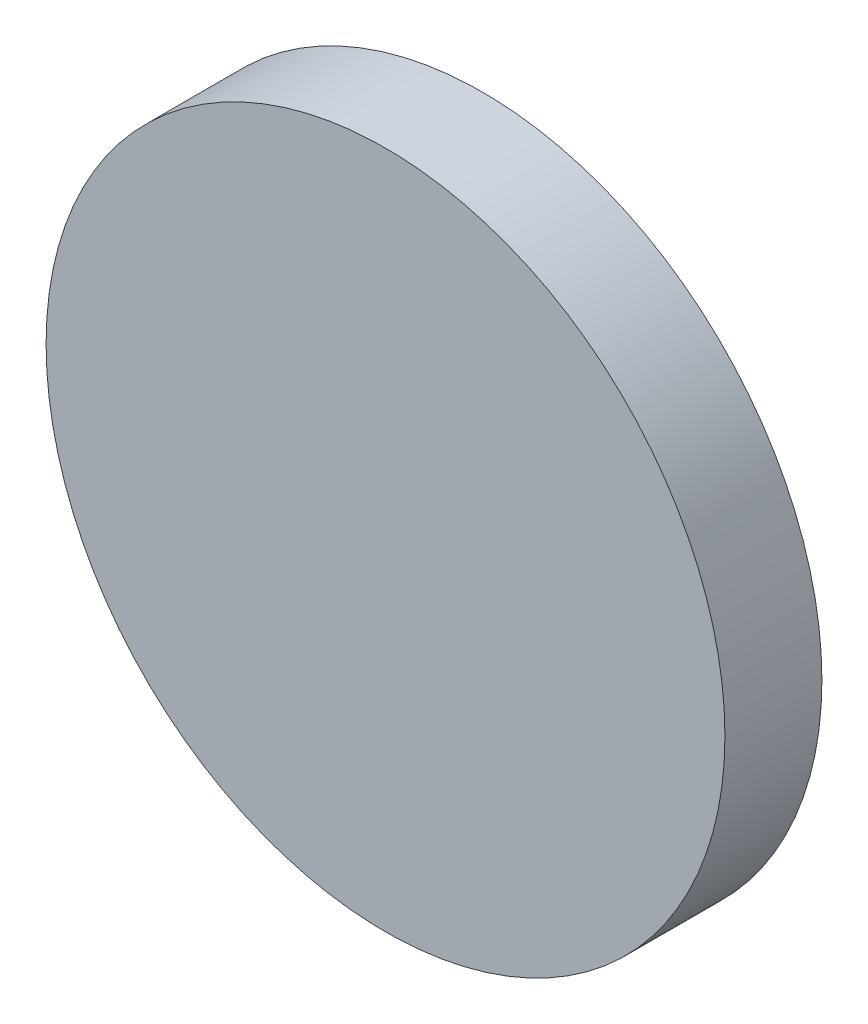
ISO-10303-21;
HEADER;
FILE_DESCRIPTION(('STEP AP214'),'2;1');
FILE_NAME('part.step','',(''),(''),'','','');
FILE_SCHEMA(('AUTOMOTIVE_DESIGN { 1 0 10303 214 1 1 1 1 }'));
ENDSEC;
DATA;
#1=APPLICATION_CONTEXT('core data for automotive mechanical design processes');
#2=APPLICATION_PROTOCOL_DEFINITION('international standard','automotive_design',2000,#1);
#3=PRODUCT_CONTEXT('',#1,'mechanical');
#4=PRODUCT('Part','Part','',(#3));
#5=PRODUCT_RELATED_PRODUCT_CATEGORY('part','',(#4));
#6=PRODUCT_DEFINITION_FORMATION('','',#4);
#7=PRODUCT_DEFINITION_CONTEXT('part definition',#1,'design');
#8=PRODUCT_DEFINITION('design','',#6,#7);
#9=PRODUCT_DEFINITION_SHAPE('','',#8);
#10=(LENGTH_UNIT() NAMED_UNIT(*) SI_UNIT(.MILLI.,.METRE.));
#11=(NAMED_UNIT(*) PLANE_ANGLE_UNIT() SI_UNIT($,.RADIAN.));
#12=(NAMED_UNIT(*) SI_UNIT($,.STERADIAN.) SOLID_ANGLE_UNIT());
#13=UNCERTAINTY_MEASURE_WITH_UNIT(LENGTH_MEASURE(1.E-05),#10,'distance_accuracy_value','');
#14=(GEOMETRIC_REPRESENTATION_CONTEXT(3) GLOBAL_UNCERTAINTY_ASSIGNED_CONTEXT((#13)) GLOBAL_UNIT_ASSIGNED_CONTEXT((#10,
#11,#12)) REPRESENTATION_CONTEXT('',''));
#15=CARTESIAN_POINT('',(0.,0.,0.));
#16=DIRECTION('',(0.,0.,1.));
#17=DIRECTION('',(1.,0.,0.));
#18=AXIS2_PLACEMENT_3D('',#15,#16,#17);
#19=CARTESIAN_POINT('',(0.,0.,4.));
#20=DIRECTION('',(0.,0.,-1.));
#21=DIRECTION('',(-1.,0.,0.));
#22=AXIS2_PLACEMENT_3D('',#19,#20,#21);
#23=CYLINDRICAL_SURFACE('',#22,14.);
#24=CARTESIAN_POINT('',(0.,0.,4.));
#25=DIRECTION('',(0.,0.,1.));
#26=DIRECTION('',(1.,0.,0.));
#27=AXIS2_PLACEMENT_3D('',#24,#25,#26);
#28=CIRCLE('',#27,14.);
#29=CARTESIAN_POINT('',(14.,0.,4.));
#30=VERTEX_POINT('',#29);
#31=EDGE_CURVE('E10',#30,#30,#28,.T.);
#32=ORIENTED_EDGE('',*,*,#31,.F.);
#33=EDGE_LOOP('',(#32));
#34=FACE_BOUND('',#33,.T.);
#35=CARTESIAN_POINT('',(0.,0.,0.));
#36=DIRECTION('',(0.,0.,1.));
#37=DIRECTION('',(1.,0.,0.));
#38=AXIS2_PLACEMENT_3D('',#35,#36,#37);
#39=CIRCLE('',#38,14.);
#40=CARTESIAN_POINT('',(14.,0.,0.));
#41=VERTEX_POINT('',#40);
#42=EDGE_CURVE('E35',#41,#41,#39,.T.);
#43=ORIENTED_EDGE('',*,*,#42,.T.);
#44=EDGE_LOOP('',(#43));
#45=FACE_BOUND('',#44,.T.);
#46=ADVANCED_FACE('F32',(#34,#45),#23,.T.);
#47=CARTESIAN_POINT('',(0.,0.,4.));
#48=DIRECTION('',(0.,0.,1.));
#49=DIRECTION('',(1.,0.,0.));
#50=AXIS2_PLACEMENT_3D('',#47,#48,#49);
#51=PLANE('',#50);
#52=ORIENTED_EDGE('',*,*,#31,.T.);
#53=EDGE_LOOP('',(#52));
#54=FACE_BOUND('',#53,.T.);
#55=ADVANCED_FACE('F47',(#54),#51,.T.);
#56=CARTESIAN_POINT('',(0.,0.,0.));
#57=DIRECTION('',(0.,0.,1.));
#58=DIRECTION('',(1.,0.,0.));
#59=AXIS2_PLACEMENT_3D('',#56,#57,#58);
#60=PLANE('',#59);
#61=ORIENTED_EDGE('',*,*,#42,.F.);
#62=EDGE_LOOP('',(#61));
#63=FACE_BOUND('',#62,.T.);
#64=ADVANCED_FACE('F45',(#63),#60,.F.);
#65=CLOSED_SHELL('',(#46,#55,#64));
#66=MANIFOLD_SOLID_BREP('B2',#65);
#67=ADVANCED_BREP_SHAPE_REPRESENTATION('',(#18,#66),#14);
#68=SHAPE_DEFINITION_REPRESENTATION(#9,#67);
ENDSEC;
END-ISO-10303-21;
